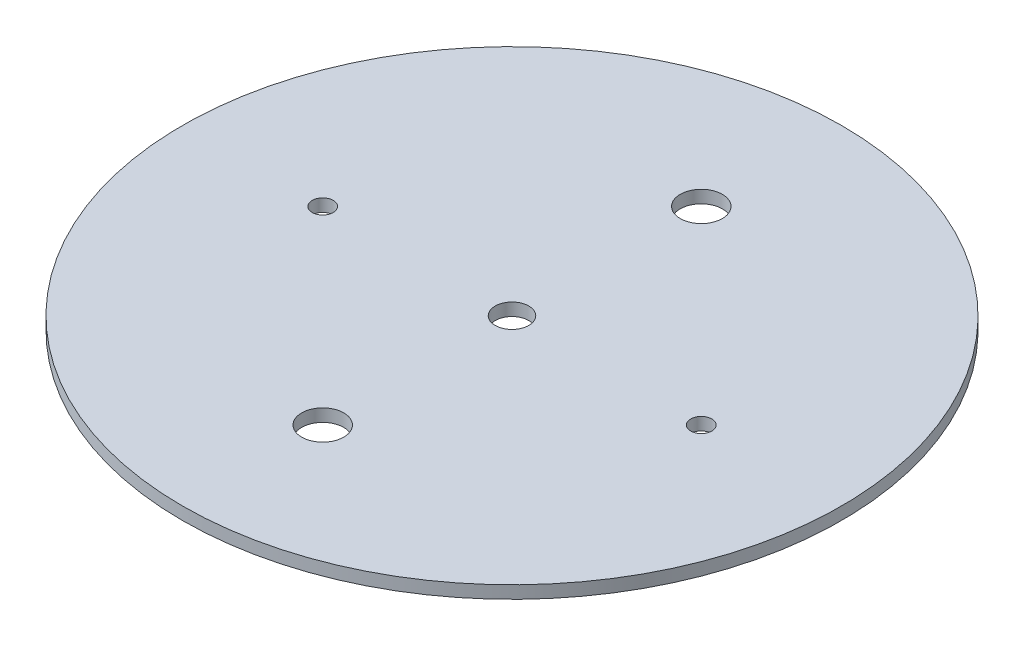
ISO-10303-21;
HEADER;
FILE_DESCRIPTION(('STEP AP214'),'2;1');
FILE_NAME('part.step','',(''),(''),'','','');
FILE_SCHEMA(('AUTOMOTIVE_DESIGN { 1 0 10303 214 1 1 1 1 }'));
ENDSEC;
DATA;
#1=APPLICATION_CONTEXT('core data for automotive mechanical design processes');
#2=APPLICATION_PROTOCOL_DEFINITION('international standard','automotive_design',2000,#1);
#3=PRODUCT_CONTEXT('',#1,'mechanical');
#4=PRODUCT('Part','Part','',(#3));
#5=PRODUCT_RELATED_PRODUCT_CATEGORY('part','',(#4));
#6=PRODUCT_DEFINITION_FORMATION('','',#4);
#7=PRODUCT_DEFINITION_CONTEXT('part definition',#1,'design');
#8=PRODUCT_DEFINITION('design','',#6,#7);
#9=PRODUCT_DEFINITION_SHAPE('','',#8);
#10=(LENGTH_UNIT() NAMED_UNIT(*) SI_UNIT(.MILLI.,.METRE.));
#11=(NAMED_UNIT(*) PLANE_ANGLE_UNIT() SI_UNIT($,.RADIAN.));
#12=(NAMED_UNIT(*) SI_UNIT($,.STERADIAN.) SOLID_ANGLE_UNIT());
#13=UNCERTAINTY_MEASURE_WITH_UNIT(LENGTH_MEASURE(1.E-05),#10,'distance_accuracy_value','');
#14=(GEOMETRIC_REPRESENTATION_CONTEXT(3) GLOBAL_UNCERTAINTY_ASSIGNED_CONTEXT((#13)) GLOBAL_UNIT_ASSIGNED_CONTEXT((#10,
#11,#12)) REPRESENTATION_CONTEXT('',''));
#15=CARTESIAN_POINT('',(0.,0.,0.));
#16=DIRECTION('',(0.,0.,1.));
#17=DIRECTION('',(1.,0.,0.));
#18=AXIS2_PLACEMENT_3D('',#15,#16,#17);
#19=CARTESIAN_POINT('',(0.,3.,45.));
#20=DIRECTION('',(0.,-1.,0.));
#21=DIRECTION('',(0.,0.,-1.));
#22=AXIS2_PLACEMENT_3D('',#19,#20,#21);
#23=CYLINDRICAL_SURFACE('',#22,5.);
#24=CARTESIAN_POINT('',(0.,3.,45.));
#25=DIRECTION('',(0.,1.,0.));
#26=DIRECTION('',(0.,0.,1.));
#27=AXIS2_PLACEMENT_3D('',#24,#25,#26);
#28=CIRCLE('',#27,5.);
#29=CARTESIAN_POINT('',(0.,3.,50.));
#30=VERTEX_POINT('',#29);
#31=EDGE_CURVE('E50',#30,#30,#28,.T.);
#32=ORIENTED_EDGE('',*,*,#31,.T.);
#33=EDGE_LOOP('',(#32));
#34=FACE_BOUND('',#33,.T.);
#35=CARTESIAN_POINT('',(0.,0.,45.));
#36=DIRECTION('',(0.,1.,0.));
#37=DIRECTION('',(0.,0.,1.));
#38=AXIS2_PLACEMENT_3D('',#35,#36,#37);
#39=CIRCLE('',#38,5.);
#40=CARTESIAN_POINT('',(0.,0.,50.));
#41=VERTEX_POINT('',#40);
#42=EDGE_CURVE('E75',#41,#41,#39,.T.);
#43=ORIENTED_EDGE('',*,*,#42,.F.);
#44=EDGE_LOOP('',(#43));
#45=FACE_BOUND('',#44,.T.);
#46=ADVANCED_FACE('F41',(#34,#45),#23,.F.);
#47=CARTESIAN_POINT('',(0.,3.,0.));
#48=DIRECTION('',(0.,-1.,0.));
#49=DIRECTION('',(0.,0.,-1.));
#50=AXIS2_PLACEMENT_3D('',#47,#48,#49);
#51=CYLINDRICAL_SURFACE('',#50,4.);
#52=CARTESIAN_POINT('',(0.,3.,0.));
#53=DIRECTION('',(0.,1.,0.));
#54=DIRECTION('',(0.,0.,1.));
#55=AXIS2_PLACEMENT_3D('',#52,#53,#54);
#56=CIRCLE('',#55,4.);
#57=CARTESIAN_POINT('',(0.,3.,4.));
#58=VERTEX_POINT('',#57);
#59=EDGE_CURVE('E56',#58,#58,#56,.T.);
#60=ORIENTED_EDGE('',*,*,#59,.T.);
#61=EDGE_LOOP('',(#60));
#62=FACE_BOUND('',#61,.T.);
#63=CARTESIAN_POINT('',(0.,0.,0.));
#64=DIRECTION('',(0.,1.,0.));
#65=DIRECTION('',(0.,0.,1.));
#66=AXIS2_PLACEMENT_3D('',#63,#64,#65);
#67=CIRCLE('',#66,4.);
#68=CARTESIAN_POINT('',(0.,0.,4.));
#69=VERTEX_POINT('',#68);
#70=EDGE_CURVE('E72',#69,#69,#67,.T.);
#71=ORIENTED_EDGE('',*,*,#70,.F.);
#72=EDGE_LOOP('',(#71));
#73=FACE_BOUND('',#72,.T.);
#74=ADVANCED_FACE('F102',(#62,#73),#51,.F.);
#75=CARTESIAN_POINT('',(45.,3.,0.));
#76=DIRECTION('',(0.,-1.,0.));
#77=DIRECTION('',(0.,0.,-1.));
#78=AXIS2_PLACEMENT_3D('',#75,#76,#77);
#79=CYLINDRICAL_SURFACE('',#78,2.5);
#80=CARTESIAN_POINT('',(45.,3.,0.));
#81=DIRECTION('',(0.,1.,0.));
#82=DIRECTION('',(0.,0.,1.));
#83=AXIS2_PLACEMENT_3D('',#80,#81,#82);
#84=CIRCLE('',#83,2.5);
#85=CARTESIAN_POINT('',(45.,3.,2.49999999999999));
#86=VERTEX_POINT('',#85);
#87=EDGE_CURVE('E93',#86,#86,#84,.T.);
#88=ORIENTED_EDGE('',*,*,#87,.T.);
#89=EDGE_LOOP('',(#88));
#90=FACE_BOUND('',#89,.T.);
#91=CARTESIAN_POINT('',(45.,0.,0.));
#92=DIRECTION('',(0.,1.,0.));
#93=DIRECTION('',(0.,0.,1.));
#94=AXIS2_PLACEMENT_3D('',#91,#92,#93);
#95=CIRCLE('',#94,2.5);
#96=CARTESIAN_POINT('',(45.,0.,2.49999999999999));
#97=VERTEX_POINT('',#96);
#98=EDGE_CURVE('E68',#97,#97,#95,.T.);
#99=ORIENTED_EDGE('',*,*,#98,.F.);
#100=EDGE_LOOP('',(#99));
#101=FACE_BOUND('',#100,.T.);
#102=ADVANCED_FACE('F119',(#90,#101),#79,.F.);
#103=CARTESIAN_POINT('',(-45.,3.,0.));
#104=DIRECTION('',(0.,-1.,0.));
#105=DIRECTION('',(0.,0.,-1.));
#106=AXIS2_PLACEMENT_3D('',#103,#104,#105);
#107=CYLINDRICAL_SURFACE('',#106,2.5);
#108=CARTESIAN_POINT('',(-45.,3.,0.));
#109=DIRECTION('',(0.,1.,0.));
#110=DIRECTION('',(0.,0.,1.));
#111=AXIS2_PLACEMENT_3D('',#108,#109,#110);
#112=CIRCLE('',#111,2.5);
#113=CARTESIAN_POINT('',(-45.,3.,2.50000000000001));
#114=VERTEX_POINT('',#113);
#115=EDGE_CURVE('E87',#114,#114,#112,.T.);
#116=ORIENTED_EDGE('',*,*,#115,.T.);
#117=EDGE_LOOP('',(#116));
#118=FACE_BOUND('',#117,.T.);
#119=CARTESIAN_POINT('',(-45.,0.,0.));
#120=DIRECTION('',(0.,1.,0.));
#121=DIRECTION('',(0.,0.,1.));
#122=AXIS2_PLACEMENT_3D('',#119,#120,#121);
#123=CIRCLE('',#122,2.5);
#124=CARTESIAN_POINT('',(-45.,0.,2.50000000000001));
#125=VERTEX_POINT('',#124);
#126=EDGE_CURVE('E64',#125,#125,#123,.T.);
#127=ORIENTED_EDGE('',*,*,#126,.F.);
#128=EDGE_LOOP('',(#127));
#129=FACE_BOUND('',#128,.T.);
#130=ADVANCED_FACE('F125',(#118,#129),#107,.F.);
#131=CARTESIAN_POINT('',(0.,3.,0.));
#132=DIRECTION('',(0.,-1.,0.));
#133=DIRECTION('',(0.,0.,-1.));
#134=AXIS2_PLACEMENT_3D('',#131,#132,#133);
#135=CYLINDRICAL_SURFACE('',#134,78.35);
#136=CARTESIAN_POINT('',(0.,3.,0.));
#137=DIRECTION('',(0.,1.,0.));
#138=DIRECTION('',(0.,0.,1.));
#139=AXIS2_PLACEMENT_3D('',#136,#137,#138);
#140=CIRCLE('',#139,78.35);
#141=CARTESIAN_POINT('',(0.,3.,78.35));
#142=VERTEX_POINT('',#141);
#143=EDGE_CURVE('E82',#142,#142,#140,.T.);
#144=ORIENTED_EDGE('',*,*,#143,.F.);
#145=EDGE_LOOP('',(#144));
#146=FACE_BOUND('',#145,.T.);
#147=CARTESIAN_POINT('',(0.,0.,0.));
#148=DIRECTION('',(0.,1.,0.));
#149=DIRECTION('',(0.,0.,1.));
#150=AXIS2_PLACEMENT_3D('',#147,#148,#149);
#151=CIRCLE('',#150,78.35);
#152=CARTESIAN_POINT('',(0.,0.,78.35));
#153=VERTEX_POINT('',#152);
#154=EDGE_CURVE('E60',#153,#153,#151,.T.);
#155=ORIENTED_EDGE('',*,*,#154,.T.);
#156=EDGE_LOOP('',(#155));
#157=FACE_BOUND('',#156,.T.);
#158=ADVANCED_FACE('F43',(#146,#157),#135,.T.);
#159=CARTESIAN_POINT('',(0.,3.,-45.));
#160=DIRECTION('',(0.,-1.,0.));
#161=DIRECTION('',(0.,0.,-1.));
#162=AXIS2_PLACEMENT_3D('',#159,#160,#161);
#163=CYLINDRICAL_SURFACE('',#162,5.);
#164=CARTESIAN_POINT('',(0.,3.,-45.));
#165=DIRECTION('',(0.,1.,0.));
#166=DIRECTION('',(0.,0.,1.));
#167=AXIS2_PLACEMENT_3D('',#164,#165,#166);
#168=CIRCLE('',#167,5.);
#169=CARTESIAN_POINT('',(0.,3.,-40.));
#170=VERTEX_POINT('',#169);
#171=EDGE_CURVE('E10',#170,#170,#168,.F.);
#172=ORIENTED_EDGE('',*,*,#171,.F.);
#173=EDGE_LOOP('',(#172));
#174=FACE_BOUND('',#173,.T.);
#175=CARTESIAN_POINT('',(0.,0.,-45.));
#176=DIRECTION('',(0.,1.,0.));
#177=DIRECTION('',(0.,0.,1.));
#178=AXIS2_PLACEMENT_3D('',#175,#176,#177);
#179=CIRCLE('',#178,5.);
#180=CARTESIAN_POINT('',(0.,0.,-40.));
#181=VERTEX_POINT('',#180);
#182=EDGE_CURVE('E45',#181,#181,#179,.F.);
#183=ORIENTED_EDGE('',*,*,#182,.T.);
#184=EDGE_LOOP('',(#183));
#185=FACE_BOUND('',#184,.T.);
#186=ADVANCED_FACE('F109',(#174,#185),#163,.F.);
#187=CARTESIAN_POINT('',(0.,3.,0.));
#188=DIRECTION('',(0.,1.,0.));
#189=DIRECTION('',(0.,0.,1.));
#190=AXIS2_PLACEMENT_3D('',#187,#188,#189);
#191=PLANE('',#190);
#192=ORIENTED_EDGE('',*,*,#143,.T.);
#193=EDGE_LOOP('',(#192));
#194=FACE_BOUND('',#193,.T.);
#195=ORIENTED_EDGE('',*,*,#115,.F.);
#196=EDGE_LOOP('',(#195));
#197=FACE_BOUND('',#196,.T.);
#198=ORIENTED_EDGE('',*,*,#87,.F.);
#199=EDGE_LOOP('',(#198));
#200=FACE_BOUND('',#199,.T.);
#201=ORIENTED_EDGE('',*,*,#59,.F.);
#202=EDGE_LOOP('',(#201));
#203=FACE_BOUND('',#202,.T.);
#204=ORIENTED_EDGE('',*,*,#31,.F.);
#205=EDGE_LOOP('',(#204));
#206=FACE_BOUND('',#205,.T.);
#207=ORIENTED_EDGE('',*,*,#171,.T.);
#208=EDGE_LOOP('',(#207));
#209=FACE_BOUND('',#208,.T.);
#210=ADVANCED_FACE('F105',(#194,#197,#200,#203,#206,#209),#191,.T.);
#211=CARTESIAN_POINT('',(0.,0.,0.));
#212=DIRECTION('',(0.,1.,0.));
#213=DIRECTION('',(0.,0.,1.));
#214=AXIS2_PLACEMENT_3D('',#211,#212,#213);
#215=PLANE('',#214);
#216=ORIENTED_EDGE('',*,*,#154,.F.);
#217=EDGE_LOOP('',(#216));
#218=FACE_BOUND('',#217,.T.);
#219=ORIENTED_EDGE('',*,*,#126,.T.);
#220=EDGE_LOOP('',(#219));
#221=FACE_BOUND('',#220,.T.);
#222=ORIENTED_EDGE('',*,*,#98,.T.);
#223=EDGE_LOOP('',(#222));
#224=FACE_BOUND('',#223,.T.);
#225=ORIENTED_EDGE('',*,*,#70,.T.);
#226=EDGE_LOOP('',(#225));
#227=FACE_BOUND('',#226,.T.);
#228=ORIENTED_EDGE('',*,*,#42,.T.);
#229=EDGE_LOOP('',(#228));
#230=FACE_BOUND('',#229,.T.);
#231=ORIENTED_EDGE('',*,*,#182,.F.);
#232=EDGE_LOOP('',(#231));
#233=FACE_BOUND('',#232,.T.);
#234=ADVANCED_FACE('F108',(#218,#221,#224,#227,#230,#233),#215,.F.);
#235=CLOSED_SHELL('',(#46,#74,#102,#130,#158,#186,#210,#234));
#236=MANIFOLD_SOLID_BREP('B2',#235);
#237=ADVANCED_BREP_SHAPE_REPRESENTATION('',(#18,#236),#14);
#238=SHAPE_DEFINITION_REPRESENTATION(#9,#237);
ENDSEC;
END-ISO-10303-21;
